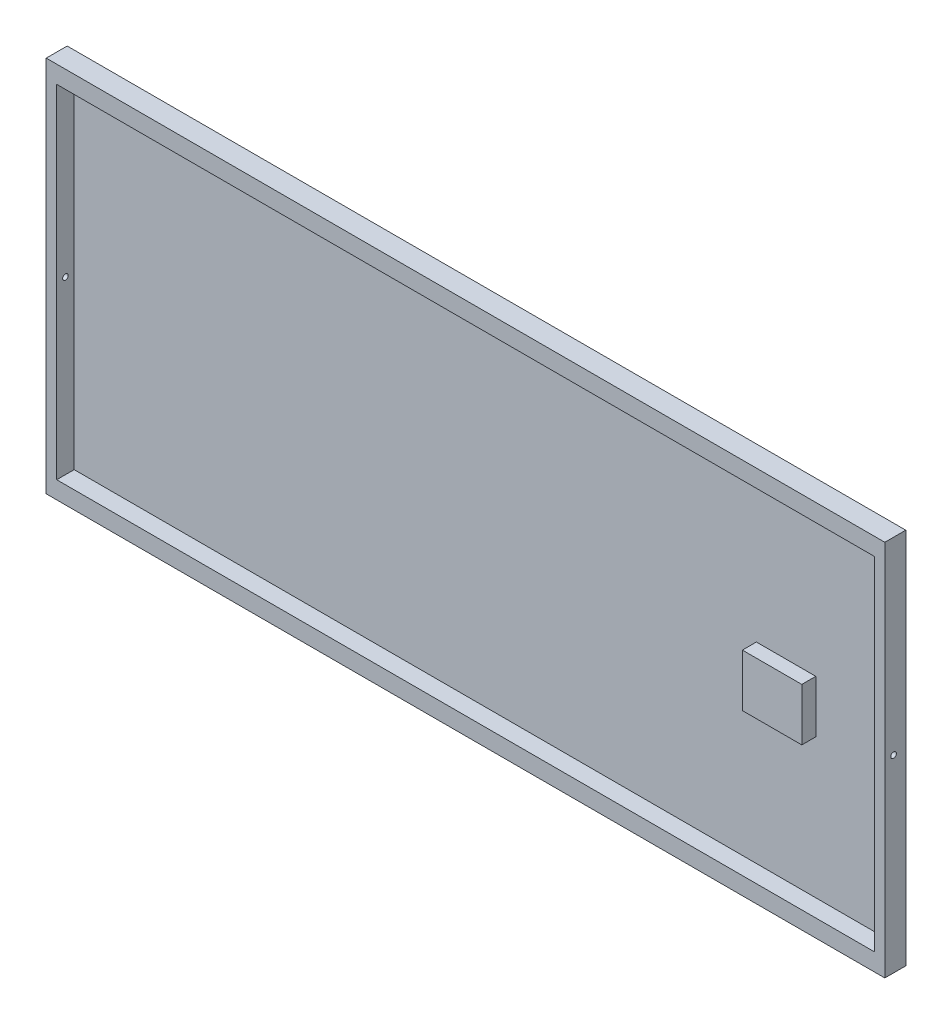
ISO-10303-21;
HEADER;
FILE_DESCRIPTION(('STEP AP214'),'2;1');
FILE_NAME('part.step','',(''),(''),'','','');
FILE_SCHEMA(('AUTOMOTIVE_DESIGN { 1 0 10303 214 1 1 1 1 }'));
ENDSEC;
DATA;
#1=APPLICATION_CONTEXT('core data for automotive mechanical design processes');
#2=APPLICATION_PROTOCOL_DEFINITION('international standard','automotive_design',2000,#1);
#3=PRODUCT_CONTEXT('',#1,'mechanical');
#4=PRODUCT('Part','Part','',(#3));
#5=PRODUCT_RELATED_PRODUCT_CATEGORY('part','',(#4));
#6=PRODUCT_DEFINITION_FORMATION('','',#4);
#7=PRODUCT_DEFINITION_CONTEXT('part definition',#1,'design');
#8=PRODUCT_DEFINITION('design','',#6,#7);
#9=PRODUCT_DEFINITION_SHAPE('','',#8);
#10=(LENGTH_UNIT() NAMED_UNIT(*) SI_UNIT(.MILLI.,.METRE.));
#11=(NAMED_UNIT(*) PLANE_ANGLE_UNIT() SI_UNIT($,.RADIAN.));
#12=(NAMED_UNIT(*) SI_UNIT($,.STERADIAN.) SOLID_ANGLE_UNIT());
#13=UNCERTAINTY_MEASURE_WITH_UNIT(LENGTH_MEASURE(1.E-05),#10,'distance_accuracy_value','');
#14=(GEOMETRIC_REPRESENTATION_CONTEXT(3) GLOBAL_UNCERTAINTY_ASSIGNED_CONTEXT((#13)) GLOBAL_UNIT_ASSIGNED_CONTEXT((#10,
#11,#12)) REPRESENTATION_CONTEXT('',''));
#15=CARTESIAN_POINT('',(0.,0.,0.));
#16=DIRECTION('',(0.,0.,1.));
#17=DIRECTION('',(1.,0.,0.));
#18=AXIS2_PLACEMENT_3D('',#15,#16,#17);
#19=CARTESIAN_POINT('',(930.672943193009,-215.300296093722,25.));
#20=DIRECTION('',(1.,0.,0.));
#21=DIRECTION('',(0.,1.,0.));
#22=AXIS2_PLACEMENT_3D('',#19,#20,#21);
#23=PLANE('',#22);
#24=CARTESIAN_POINT('',(930.672943193009,-230.168976304114,15.686983343187));
#25=DIRECTION('',(1.,0.,0.));
#26=DIRECTION('',(0.,1.,0.));
#27=AXIS2_PLACEMENT_3D('',#24,#25,#26);
#28=CIRCLE('',#27,2.5);
#29=CARTESIAN_POINT('',(930.672943193009,-227.668976304114,15.686983343187));
#30=VERTEX_POINT('',#29);
#31=EDGE_CURVE('E40',#30,#30,#28,.F.);
#32=ORIENTED_EDGE('',*,*,#31,.F.);
#33=EDGE_LOOP('',(#32));
#34=FACE_BOUND('',#33,.T.);
#35=DIRECTION('',(0.,-1.,0.));
#36=VECTOR('',#35,1.);
#37=CARTESIAN_POINT('',(930.672943193009,-215.300296093722,5.));
#38=LINE('',#37,#36);
#39=CARTESIAN_POINT('',(930.672943193009,-215.300296093722,5.));
#40=VERTEX_POINT('',#39);
#41=CARTESIAN_POINT('',(930.672943193009,-290.300296093722,5.));
#42=VERTEX_POINT('',#41);
#43=EDGE_CURVE('E144',#40,#42,#38,.T.);
#44=ORIENTED_EDGE('',*,*,#43,.T.);
#45=DIRECTION('',(0.,0.,-1.));
#46=VECTOR('',#45,1.);
#47=CARTESIAN_POINT('',(930.672943193009,-290.300296093722,25.));
#48=LINE('',#47,#46);
#49=CARTESIAN_POINT('',(930.672943193009,-290.300296093722,25.));
#50=VERTEX_POINT('',#49);
#51=EDGE_CURVE('E125',#50,#42,#48,.T.);
#52=ORIENTED_EDGE('',*,*,#51,.F.);
#53=DIRECTION('',(0.,-1.,0.));
#54=VECTOR('',#53,1.);
#55=CARTESIAN_POINT('',(930.672943193009,-215.300296093722,25.));
#56=LINE('',#55,#54);
#57=CARTESIAN_POINT('',(930.672943193009,-215.300296093722,25.));
#58=VERTEX_POINT('',#57);
#59=EDGE_CURVE('E132',#58,#50,#56,.T.);
#60=ORIENTED_EDGE('',*,*,#59,.F.);
#61=DIRECTION('',(0.,0.,-1.));
#62=VECTOR('',#61,1.);
#63=CARTESIAN_POINT('',(930.672943193009,-215.300296093722,25.));
#64=LINE('',#63,#62);
#65=EDGE_CURVE('E342',#58,#40,#64,.T.);
#66=ORIENTED_EDGE('',*,*,#65,.T.);
#67=EDGE_LOOP('',(#44,#52,#60,#66));
#68=FACE_BOUND('',#67,.T.);
#69=CARTESIAN_POINT('',(930.672943193009,-239.791974011941,15.686983343187));
#70=DIRECTION('',(1.,0.,0.));
#71=DIRECTION('',(0.,1.,0.));
#72=AXIS2_PLACEMENT_3D('',#69,#70,#71);
#73=CIRCLE('',#72,2.5);
#74=CARTESIAN_POINT('',(930.672943193009,-237.291974011941,15.686983343187));
#75=VERTEX_POINT('',#74);
#76=EDGE_CURVE('E11',#75,#75,#73,.F.);
#77=ORIENTED_EDGE('',*,*,#76,.F.);
#78=EDGE_LOOP('',(#77));
#79=FACE_BOUND('',#78,.T.);
#80=ADVANCED_FACE('F32',(#34,#68,#79),#23,.F.);
#81=CARTESIAN_POINT('',(-45.539504341441,-489.7752065244,5.));
#82=DIRECTION('',(0.,0.,1.));
#83=DIRECTION('',(1.,0.,0.));
#84=AXIS2_PLACEMENT_3D('',#81,#82,#83);
#85=PLANE('',#84);
#86=DIRECTION('',(0.,-1.,0.));
#87=VECTOR('',#86,1.);
#88=CARTESIAN_POINT('',(-45.539504341441,0.224793475600442,5.));
#89=LINE('',#88,#87);
#90=CARTESIAN_POINT('',(-45.539504341441,0.224793475600442,5.));
#91=VERTEX_POINT('',#90);
#92=CARTESIAN_POINT('',(-45.539504341441,-489.7752065244,5.));
#93=VERTEX_POINT('',#92);
#94=EDGE_CURVE('E160',#91,#93,#89,.T.);
#95=ORIENTED_EDGE('',*,*,#94,.T.);
#96=DIRECTION('',(1.,0.,0.));
#97=VECTOR('',#96,1.);
#98=CARTESIAN_POINT('',(-45.539504341441,-489.7752065244,5.));
#99=LINE('',#98,#97);
#100=CARTESIAN_POINT('',(1124.46049565856,-489.7752065244,5.));
#101=VERTEX_POINT('',#100);
#102=EDGE_CURVE('E163',#93,#101,#99,.T.);
#103=ORIENTED_EDGE('',*,*,#102,.T.);
#104=DIRECTION('',(0.,1.,0.));
#105=VECTOR('',#104,1.);
#106=CARTESIAN_POINT('',(1124.46049565856,0.224793475600442,5.));
#107=LINE('',#106,#105);
#108=CARTESIAN_POINT('',(1124.46049565856,0.224793475600442,5.));
#109=VERTEX_POINT('',#108);
#110=EDGE_CURVE('E167',#101,#109,#107,.T.);
#111=ORIENTED_EDGE('',*,*,#110,.T.);
#112=DIRECTION('',(-1.,0.,0.));
#113=VECTOR('',#112,1.);
#114=CARTESIAN_POINT('',(-45.539504341441,0.224793475600442,5.));
#115=LINE('',#114,#113);
#116=EDGE_CURVE('E170',#109,#91,#115,.T.);
#117=ORIENTED_EDGE('',*,*,#116,.T.);
#118=EDGE_LOOP('',(#95,#103,#111,#117));
#119=FACE_BOUND('',#118,.T.);
#120=DIRECTION('',(1.,0.,0.));
#121=VECTOR('',#120,1.);
#122=CARTESIAN_POINT('',(930.672943193009,-290.300296093722,5.));
#123=LINE('',#122,#121);
#124=CARTESIAN_POINT('',(1015.67294319301,-290.300296093722,5.));
#125=VERTEX_POINT('',#124);
#126=EDGE_CURVE('E344',#42,#125,#123,.T.);
#127=ORIENTED_EDGE('',*,*,#126,.F.);
#128=ORIENTED_EDGE('',*,*,#43,.F.);
#129=DIRECTION('',(-1.,0.,0.));
#130=VECTOR('',#129,1.);
#131=CARTESIAN_POINT('',(930.672943193009,-215.300296093722,5.));
#132=LINE('',#131,#130);
#133=CARTESIAN_POINT('',(1015.67294319301,-215.300296093722,5.));
#134=VERTEX_POINT('',#133);
#135=EDGE_CURVE('E140',#134,#40,#132,.T.);
#136=ORIENTED_EDGE('',*,*,#135,.F.);
#137=DIRECTION('',(0.,1.,0.));
#138=VECTOR('',#137,1.);
#139=CARTESIAN_POINT('',(1015.67294319301,-215.300296093722,5.));
#140=LINE('',#139,#138);
#141=EDGE_CURVE('E346',#125,#134,#140,.T.);
#142=ORIENTED_EDGE('',*,*,#141,.F.);
#143=EDGE_LOOP('',(#127,#128,#136,#142));
#144=FACE_BOUND('',#143,.T.);
#145=ADVANCED_FACE('F227',(#119,#144),#85,.T.);
#146=CARTESIAN_POINT('',(-60.539504341441,25.2247934756004,30.));
#147=DIRECTION('',(1.,0.,0.));
#148=DIRECTION('',(0.,1.,0.));
#149=AXIS2_PLACEMENT_3D('',#146,#147,#148);
#150=PLANE('',#149);
#151=CARTESIAN_POINT('',(-60.539504341441,-244.7752065244,17.5));
#152=DIRECTION('',(-1.,0.,0.));
#153=DIRECTION('',(0.,-1.,0.));
#154=AXIS2_PLACEMENT_3D('',#151,#152,#153);
#155=CIRCLE('',#154,4.);
#156=CARTESIAN_POINT('',(-60.539504341441,-248.7752065244,17.5));
#157=VERTEX_POINT('',#156);
#158=EDGE_CURVE('E146',#157,#157,#155,.T.);
#159=ORIENTED_EDGE('',*,*,#158,.F.);
#160=EDGE_LOOP('',(#159));
#161=FACE_BOUND('',#160,.T.);
#162=DIRECTION('',(0.,-1.,0.));
#163=VECTOR('',#162,1.);
#164=CARTESIAN_POINT('',(-60.539504341441,25.2247934756004,0.));
#165=LINE('',#164,#163);
#166=CARTESIAN_POINT('',(-60.539504341441,25.2247934756004,0.));
#167=VERTEX_POINT('',#166);
#168=CARTESIAN_POINT('',(-60.539504341441,-514.7752065244,0.));
#169=VERTEX_POINT('',#168);
#170=EDGE_CURVE('E185',#167,#169,#165,.T.);
#171=ORIENTED_EDGE('',*,*,#170,.T.);
#172=DIRECTION('',(0.,0.,-1.));
#173=VECTOR('',#172,1.);
#174=CARTESIAN_POINT('',(-60.539504341441,-514.7752065244,30.));
#175=LINE('',#174,#173);
#176=CARTESIAN_POINT('',(-60.539504341441,-514.7752065244,30.));
#177=VERTEX_POINT('',#176);
#178=EDGE_CURVE('E217',#177,#169,#175,.T.);
#179=ORIENTED_EDGE('',*,*,#178,.F.);
#180=DIRECTION('',(0.,-1.,0.));
#181=VECTOR('',#180,1.);
#182=CARTESIAN_POINT('',(-60.539504341441,25.2247934756004,30.));
#183=LINE('',#182,#181);
#184=CARTESIAN_POINT('',(-60.539504341441,25.2247934756004,30.));
#185=VERTEX_POINT('',#184);
#186=EDGE_CURVE('E191',#185,#177,#183,.T.);
#187=ORIENTED_EDGE('',*,*,#186,.F.);
#188=DIRECTION('',(0.,0.,-1.));
#189=VECTOR('',#188,1.);
#190=CARTESIAN_POINT('',(-60.539504341441,25.2247934756004,30.));
#191=LINE('',#190,#189);
#192=EDGE_CURVE('E201',#185,#167,#191,.T.);
#193=ORIENTED_EDGE('',*,*,#192,.T.);
#194=EDGE_LOOP('',(#171,#179,#187,#193));
#195=FACE_BOUND('',#194,.T.);
#196=ADVANCED_FACE('F34',(#161,#195),#150,.F.);
#197=CARTESIAN_POINT('',(-60.539504341441,-514.7752065244,30.));
#198=DIRECTION('',(0.,1.,0.));
#199=DIRECTION('',(0.,0.,1.));
#200=AXIS2_PLACEMENT_3D('',#197,#198,#199);
#201=PLANE('',#200);
#202=DIRECTION('',(1.,0.,0.));
#203=VECTOR('',#202,1.);
#204=CARTESIAN_POINT('',(-60.539504341441,-514.7752065244,0.));
#205=LINE('',#204,#203);
#206=CARTESIAN_POINT('',(1139.46049565856,-514.7752065244,0.));
#207=VERTEX_POINT('',#206);
#208=EDGE_CURVE('E204',#169,#207,#205,.T.);
#209=ORIENTED_EDGE('',*,*,#208,.T.);
#210=DIRECTION('',(0.,0.,-1.));
#211=VECTOR('',#210,1.);
#212=CARTESIAN_POINT('',(1139.46049565856,-514.7752065244,30.));
#213=LINE('',#212,#211);
#214=CARTESIAN_POINT('',(1139.46049565856,-514.7752065244,30.));
#215=VERTEX_POINT('',#214);
#216=EDGE_CURVE('E214',#215,#207,#213,.T.);
#217=ORIENTED_EDGE('',*,*,#216,.F.);
#218=DIRECTION('',(1.,0.,0.));
#219=VECTOR('',#218,1.);
#220=CARTESIAN_POINT('',(-60.539504341441,-514.7752065244,30.));
#221=LINE('',#220,#219);
#222=EDGE_CURVE('E194',#177,#215,#221,.T.);
#223=ORIENTED_EDGE('',*,*,#222,.F.);
#224=ORIENTED_EDGE('',*,*,#178,.T.);
#225=EDGE_LOOP('',(#209,#217,#223,#224));
#226=FACE_BOUND('',#225,.T.);
#227=ADVANCED_FACE('F272',(#226),#201,.F.);
#228=CARTESIAN_POINT('',(1139.46049565856,25.2247934756004,30.));
#229=DIRECTION('',(-1.,0.,0.));
#230=DIRECTION('',(0.,0.,1.));
#231=AXIS2_PLACEMENT_3D('',#228,#229,#230);
#232=PLANE('',#231);
#233=CARTESIAN_POINT('',(1139.46049565856,-244.775206524399,17.5));
#234=DIRECTION('',(-1.,0.,0.));
#235=DIRECTION('',(0.,0.,1.));
#236=AXIS2_PLACEMENT_3D('',#233,#234,#235);
#237=CIRCLE('',#236,4.);
#238=CARTESIAN_POINT('',(1139.46049565856,-244.775206524399,21.5));
#239=VERTEX_POINT('',#238);
#240=EDGE_CURVE('E157',#239,#239,#237,.T.);
#241=ORIENTED_EDGE('',*,*,#240,.T.);
#242=EDGE_LOOP('',(#241));
#243=FACE_BOUND('',#242,.T.);
#244=DIRECTION('',(0.,1.,0.));
#245=VECTOR('',#244,1.);
#246=CARTESIAN_POINT('',(1139.46049565856,25.2247934756004,0.));
#247=LINE('',#246,#245);
#248=CARTESIAN_POINT('',(1139.46049565856,25.2247934756004,0.));
#249=VERTEX_POINT('',#248);
#250=EDGE_CURVE('E206',#207,#249,#247,.T.);
#251=ORIENTED_EDGE('',*,*,#250,.T.);
#252=DIRECTION('',(0.,0.,-1.));
#253=VECTOR('',#252,1.);
#254=CARTESIAN_POINT('',(1139.46049565856,25.2247934756004,30.));
#255=LINE('',#254,#253);
#256=CARTESIAN_POINT('',(1139.46049565856,25.2247934756004,30.));
#257=VERTEX_POINT('',#256);
#258=EDGE_CURVE('E211',#257,#249,#255,.T.);
#259=ORIENTED_EDGE('',*,*,#258,.F.);
#260=DIRECTION('',(0.,1.,0.));
#261=VECTOR('',#260,1.);
#262=CARTESIAN_POINT('',(1139.46049565856,25.2247934756004,30.));
#263=LINE('',#262,#261);
#264=EDGE_CURVE('E197',#215,#257,#263,.T.);
#265=ORIENTED_EDGE('',*,*,#264,.F.);
#266=ORIENTED_EDGE('',*,*,#216,.T.);
#267=EDGE_LOOP('',(#251,#259,#265,#266));
#268=FACE_BOUND('',#267,.T.);
#269=ADVANCED_FACE('F269',(#243,#268),#232,.F.);
#270=CARTESIAN_POINT('',(-60.539504341441,25.2247934756004,30.));
#271=DIRECTION('',(0.,-1.,0.));
#272=DIRECTION('',(0.,0.,-1.));
#273=AXIS2_PLACEMENT_3D('',#270,#271,#272);
#274=PLANE('',#273);
#275=DIRECTION('',(-1.,0.,0.));
#276=VECTOR('',#275,1.);
#277=CARTESIAN_POINT('',(-60.539504341441,25.2247934756004,0.));
#278=LINE('',#277,#276);
#279=EDGE_CURVE('E195',#249,#167,#278,.T.);
#280=ORIENTED_EDGE('',*,*,#279,.T.);
#281=ORIENTED_EDGE('',*,*,#192,.F.);
#282=DIRECTION('',(-1.,0.,0.));
#283=VECTOR('',#282,1.);
#284=CARTESIAN_POINT('',(-60.539504341441,25.2247934756004,30.));
#285=LINE('',#284,#283);
#286=EDGE_CURVE('E199',#257,#185,#285,.T.);
#287=ORIENTED_EDGE('',*,*,#286,.F.);
#288=ORIENTED_EDGE('',*,*,#258,.T.);
#289=EDGE_LOOP('',(#280,#281,#287,#288));
#290=FACE_BOUND('',#289,.T.);
#291=ADVANCED_FACE('F262',(#290),#274,.F.);
#292=CARTESIAN_POINT('',(-60.539504341441,-514.7752065244,30.));
#293=DIRECTION('',(0.,0.,1.));
#294=DIRECTION('',(1.,0.,0.));
#295=AXIS2_PLACEMENT_3D('',#292,#293,#294);
#296=PLANE('',#295);
#297=DIRECTION('',(0.,-1.,0.));
#298=VECTOR('',#297,1.);
#299=CARTESIAN_POINT('',(-45.539504341441,0.224793475600442,30.));
#300=LINE('',#299,#298);
#301=CARTESIAN_POINT('',(-45.539504341441,0.224793475600442,30.));
#302=VERTEX_POINT('',#301);
#303=CARTESIAN_POINT('',(-45.539504341441,-489.7752065244,30.));
#304=VERTEX_POINT('',#303);
#305=EDGE_CURVE('E55',#302,#304,#300,.T.);
#306=ORIENTED_EDGE('',*,*,#305,.F.);
#307=DIRECTION('',(-1.,0.,0.));
#308=VECTOR('',#307,1.);
#309=CARTESIAN_POINT('',(-45.539504341441,0.224793475600442,30.));
#310=LINE('',#309,#308);
#311=CARTESIAN_POINT('',(1124.46049565856,0.224793475600442,30.));
#312=VERTEX_POINT('',#311);
#313=EDGE_CURVE('E164',#312,#302,#310,.T.);
#314=ORIENTED_EDGE('',*,*,#313,.F.);
#315=DIRECTION('',(0.,1.,0.));
#316=VECTOR('',#315,1.);
#317=CARTESIAN_POINT('',(1124.46049565856,0.224793475600442,30.));
#318=LINE('',#317,#316);
#319=CARTESIAN_POINT('',(1124.46049565856,-489.7752065244,30.));
#320=VERTEX_POINT('',#319);
#321=EDGE_CURVE('E178',#320,#312,#318,.T.);
#322=ORIENTED_EDGE('',*,*,#321,.F.);
#323=DIRECTION('',(1.,0.,0.));
#324=VECTOR('',#323,1.);
#325=CARTESIAN_POINT('',(-45.539504341441,-489.7752065244,30.));
#326=LINE('',#325,#324);
#327=EDGE_CURVE('E175',#304,#320,#326,.T.);
#328=ORIENTED_EDGE('',*,*,#327,.F.);
#329=EDGE_LOOP('',(#306,#314,#322,#328));
#330=FACE_BOUND('',#329,.T.);
#331=ORIENTED_EDGE('',*,*,#186,.T.);
#332=ORIENTED_EDGE('',*,*,#222,.T.);
#333=ORIENTED_EDGE('',*,*,#264,.T.);
#334=ORIENTED_EDGE('',*,*,#286,.T.);
#335=EDGE_LOOP('',(#331,#332,#333,#334));
#336=FACE_BOUND('',#335,.T.);
#337=ADVANCED_FACE('F259',(#330,#336),#296,.T.);
#338=CARTESIAN_POINT('',(-60.539504341441,-514.7752065244,0.));
#339=DIRECTION('',(0.,0.,1.));
#340=DIRECTION('',(1.,0.,0.));
#341=AXIS2_PLACEMENT_3D('',#338,#339,#340);
#342=PLANE('',#341);
#343=ORIENTED_EDGE('',*,*,#170,.F.);
#344=ORIENTED_EDGE('',*,*,#279,.F.);
#345=ORIENTED_EDGE('',*,*,#250,.F.);
#346=ORIENTED_EDGE('',*,*,#208,.F.);
#347=EDGE_LOOP('',(#343,#344,#345,#346));
#348=FACE_BOUND('',#347,.T.);
#349=ADVANCED_FACE('F257',(#348),#342,.F.);
#350=CARTESIAN_POINT('',(-45.539504341441,0.224793475600442,5.));
#351=DIRECTION('',(-1.,0.,0.));
#352=DIRECTION('',(0.,-1.,0.));
#353=AXIS2_PLACEMENT_3D('',#350,#351,#352);
#354=PLANE('',#353);
#355=CARTESIAN_POINT('',(-45.5395043414413,-244.7752065244,17.5));
#356=DIRECTION('',(-1.,0.,0.));
#357=DIRECTION('',(0.,-1.,0.));
#358=AXIS2_PLACEMENT_3D('',#355,#356,#357);
#359=CIRCLE('',#358,4.);
#360=CARTESIAN_POINT('',(-45.5395043414413,-248.7752065244,17.5));
#361=VERTEX_POINT('',#360);
#362=EDGE_CURVE('E154',#361,#361,#359,.T.);
#363=ORIENTED_EDGE('',*,*,#362,.T.);
#364=EDGE_LOOP('',(#363));
#365=FACE_BOUND('',#364,.T.);
#366=ORIENTED_EDGE('',*,*,#305,.T.);
#367=DIRECTION('',(0.,0.,1.));
#368=VECTOR('',#367,1.);
#369=CARTESIAN_POINT('',(-45.539504341441,-489.7752065244,5.));
#370=LINE('',#369,#368);
#371=EDGE_CURVE('E173',#93,#304,#370,.T.);
#372=ORIENTED_EDGE('',*,*,#371,.F.);
#373=ORIENTED_EDGE('',*,*,#94,.F.);
#374=DIRECTION('',(0.,0.,1.));
#375=VECTOR('',#374,1.);
#376=CARTESIAN_POINT('',(-45.539504341441,0.224793475600442,5.));
#377=LINE('',#376,#375);
#378=EDGE_CURVE('E183',#91,#302,#377,.T.);
#379=ORIENTED_EDGE('',*,*,#378,.T.);
#380=EDGE_LOOP('',(#366,#372,#373,#379));
#381=FACE_BOUND('',#380,.T.);
#382=ADVANCED_FACE('F247',(#365,#381),#354,.F.);
#383=CARTESIAN_POINT('',(-45.539504341441,0.224793475600442,5.));
#384=DIRECTION('',(0.,1.,0.));
#385=DIRECTION('',(0.,0.,1.));
#386=AXIS2_PLACEMENT_3D('',#383,#384,#385);
#387=PLANE('',#386);
#388=ORIENTED_EDGE('',*,*,#313,.T.);
#389=ORIENTED_EDGE('',*,*,#378,.F.);
#390=ORIENTED_EDGE('',*,*,#116,.F.);
#391=DIRECTION('',(0.,0.,1.));
#392=VECTOR('',#391,1.);
#393=CARTESIAN_POINT('',(1124.46049565856,0.224793475600442,5.));
#394=LINE('',#393,#392);
#395=EDGE_CURVE('E186',#109,#312,#394,.T.);
#396=ORIENTED_EDGE('',*,*,#395,.T.);
#397=EDGE_LOOP('',(#388,#389,#390,#396));
#398=FACE_BOUND('',#397,.T.);
#399=ADVANCED_FACE('F243',(#398),#387,.F.);
#400=CARTESIAN_POINT('',(1124.46049565856,0.224793475600442,5.));
#401=DIRECTION('',(1.,0.,0.));
#402=DIRECTION('',(0.,0.,-1.));
#403=AXIS2_PLACEMENT_3D('',#400,#401,#402);
#404=PLANE('',#403);
#405=CARTESIAN_POINT('',(1124.46049565856,-244.775206524399,17.5));
#406=DIRECTION('',(1.,0.,0.));
#407=DIRECTION('',(0.,0.,-1.));
#408=AXIS2_PLACEMENT_3D('',#405,#406,#407);
#409=CIRCLE('',#408,4.);
#410=CARTESIAN_POINT('',(1124.46049565856,-244.775206524399,13.5));
#411=VERTEX_POINT('',#410);
#412=EDGE_CURVE('E149',#411,#411,#409,.T.);
#413=ORIENTED_EDGE('',*,*,#412,.T.);
#414=EDGE_LOOP('',(#413));
#415=FACE_BOUND('',#414,.T.);
#416=ORIENTED_EDGE('',*,*,#321,.T.);
#417=ORIENTED_EDGE('',*,*,#395,.F.);
#418=ORIENTED_EDGE('',*,*,#110,.F.);
#419=DIRECTION('',(0.,0.,1.));
#420=VECTOR('',#419,1.);
#421=CARTESIAN_POINT('',(1124.46049565856,-489.7752065244,5.));
#422=LINE('',#421,#420);
#423=EDGE_CURVE('E188',#101,#320,#422,.T.);
#424=ORIENTED_EDGE('',*,*,#423,.T.);
#425=EDGE_LOOP('',(#416,#417,#418,#424));
#426=FACE_BOUND('',#425,.T.);
#427=ADVANCED_FACE('F246',(#415,#426),#404,.F.);
#428=CARTESIAN_POINT('',(-45.539504341441,-489.7752065244,5.));
#429=DIRECTION('',(0.,-1.,0.));
#430=DIRECTION('',(0.,0.,-1.));
#431=AXIS2_PLACEMENT_3D('',#428,#429,#430);
#432=PLANE('',#431);
#433=ORIENTED_EDGE('',*,*,#327,.T.);
#434=ORIENTED_EDGE('',*,*,#423,.F.);
#435=ORIENTED_EDGE('',*,*,#102,.F.);
#436=ORIENTED_EDGE('',*,*,#371,.T.);
#437=EDGE_LOOP('',(#433,#434,#435,#436));
#438=FACE_BOUND('',#437,.T.);
#439=ADVANCED_FACE('F240',(#438),#432,.F.);
#440=CARTESIAN_POINT('',(11939.4604956586,-244.775206524398,17.5));
#441=DIRECTION('',(-1.,0.,0.));
#442=DIRECTION('',(0.,-1.,0.));
#443=AXIS2_PLACEMENT_3D('',#440,#441,#442);
#444=CYLINDRICAL_SURFACE('',#443,4.);
#445=ORIENTED_EDGE('',*,*,#412,.F.);
#446=EDGE_LOOP('',(#445));
#447=FACE_BOUND('',#446,.T.);
#448=ORIENTED_EDGE('',*,*,#240,.F.);
#449=EDGE_LOOP('',(#448));
#450=FACE_BOUND('',#449,.T.);
#451=ADVANCED_FACE('F237',(#447,#450),#444,.F.);
#452=ORIENTED_EDGE('',*,*,#158,.T.);
#453=EDGE_LOOP('',(#452));
#454=FACE_BOUND('',#453,.T.);
#455=ORIENTED_EDGE('',*,*,#362,.F.);
#456=EDGE_LOOP('',(#455));
#457=FACE_BOUND('',#456,.T.);
#458=ADVANCED_FACE('F239',(#454,#457),#444,.F.);
#459=CARTESIAN_POINT('',(930.672943193009,-290.300296093722,25.));
#460=DIRECTION('',(0.,1.,0.));
#461=DIRECTION('',(0.,0.,1.));
#462=AXIS2_PLACEMENT_3D('',#459,#460,#461);
#463=PLANE('',#462);
#464=ORIENTED_EDGE('',*,*,#126,.T.);
#465=DIRECTION('',(0.,0.,-1.));
#466=VECTOR('',#465,1.);
#467=CARTESIAN_POINT('',(1015.67294319301,-290.300296093722,25.));
#468=LINE('',#467,#466);
#469=CARTESIAN_POINT('',(1015.67294319301,-290.300296093722,25.));
#470=VERTEX_POINT('',#469);
#471=EDGE_CURVE('E128',#470,#125,#468,.T.);
#472=ORIENTED_EDGE('',*,*,#471,.F.);
#473=DIRECTION('',(1.,0.,0.));
#474=VECTOR('',#473,1.);
#475=CARTESIAN_POINT('',(930.672943193009,-290.300296093722,25.));
#476=LINE('',#475,#474);
#477=EDGE_CURVE('E121',#50,#470,#476,.T.);
#478=ORIENTED_EDGE('',*,*,#477,.F.);
#479=ORIENTED_EDGE('',*,*,#51,.T.);
#480=EDGE_LOOP('',(#464,#472,#478,#479));
#481=FACE_BOUND('',#480,.T.);
#482=ADVANCED_FACE('F123',(#481),#463,.F.);
#483=CARTESIAN_POINT('',(1015.67294319301,-215.300296093722,25.));
#484=DIRECTION('',(-1.,0.,0.));
#485=DIRECTION('',(0.,0.,1.));
#486=AXIS2_PLACEMENT_3D('',#483,#484,#485);
#487=PLANE('',#486);
#488=ORIENTED_EDGE('',*,*,#141,.T.);
#489=DIRECTION('',(0.,0.,-1.));
#490=VECTOR('',#489,1.);
#491=CARTESIAN_POINT('',(1015.67294319301,-215.300296093722,25.));
#492=LINE('',#491,#490);
#493=CARTESIAN_POINT('',(1015.67294319301,-215.300296093722,25.));
#494=VERTEX_POINT('',#493);
#495=EDGE_CURVE('E47',#494,#134,#492,.T.);
#496=ORIENTED_EDGE('',*,*,#495,.F.);
#497=DIRECTION('',(0.,1.,0.));
#498=VECTOR('',#497,1.);
#499=CARTESIAN_POINT('',(1015.67294319301,-215.300296093722,25.));
#500=LINE('',#499,#498);
#501=EDGE_CURVE('E131',#470,#494,#500,.T.);
#502=ORIENTED_EDGE('',*,*,#501,.F.);
#503=ORIENTED_EDGE('',*,*,#471,.T.);
#504=EDGE_LOOP('',(#488,#496,#502,#503));
#505=FACE_BOUND('',#504,.T.);
#506=ADVANCED_FACE('F303',(#505),#487,.F.);
#507=CARTESIAN_POINT('',(930.672943193009,-215.300296093722,25.));
#508=DIRECTION('',(0.,-1.,0.));
#509=DIRECTION('',(0.,0.,-1.));
#510=AXIS2_PLACEMENT_3D('',#507,#508,#509);
#511=PLANE('',#510);
#512=ORIENTED_EDGE('',*,*,#135,.T.);
#513=ORIENTED_EDGE('',*,*,#65,.F.);
#514=DIRECTION('',(-1.,0.,0.));
#515=VECTOR('',#514,1.);
#516=CARTESIAN_POINT('',(930.672943193009,-215.300296093722,25.));
#517=LINE('',#516,#515);
#518=EDGE_CURVE('E136',#494,#58,#517,.T.);
#519=ORIENTED_EDGE('',*,*,#518,.F.);
#520=ORIENTED_EDGE('',*,*,#495,.T.);
#521=EDGE_LOOP('',(#512,#513,#519,#520));
#522=FACE_BOUND('',#521,.T.);
#523=ADVANCED_FACE('F307',(#522),#511,.F.);
#524=CARTESIAN_POINT('',(930.672943193009,-290.300296093722,25.));
#525=DIRECTION('',(0.,0.,1.));
#526=DIRECTION('',(1.,0.,0.));
#527=AXIS2_PLACEMENT_3D('',#524,#525,#526);
#528=PLANE('',#527);
#529=ORIENTED_EDGE('',*,*,#59,.T.);
#530=ORIENTED_EDGE('',*,*,#477,.T.);
#531=ORIENTED_EDGE('',*,*,#501,.T.);
#532=ORIENTED_EDGE('',*,*,#518,.T.);
#533=EDGE_LOOP('',(#529,#530,#531,#532));
#534=FACE_BOUND('',#533,.T.);
#535=ADVANCED_FACE('F135',(#534),#528,.T.);
#536=CARTESIAN_POINT('',(925.672943193009,-230.168976304114,15.686983343187));
#537=DIRECTION('',(1.,0.,0.));
#538=DIRECTION('',(0.,1.,0.));
#539=AXIS2_PLACEMENT_3D('',#536,#537,#538);
#540=CYLINDRICAL_SURFACE('',#539,2.5);
#541=CARTESIAN_POINT('',(925.672943193009,-230.168976304114,15.686983343187));
#542=DIRECTION('',(-1.,0.,0.));
#543=DIRECTION('',(0.,-1.,0.));
#544=AXIS2_PLACEMENT_3D('',#541,#542,#543);
#545=CIRCLE('',#544,2.5);
#546=CARTESIAN_POINT('',(925.672943193009,-232.668976304114,15.686983343187));
#547=VERTEX_POINT('',#546);
#548=EDGE_CURVE('E335',#547,#547,#545,.T.);
#549=ORIENTED_EDGE('',*,*,#548,.F.);
#550=EDGE_LOOP('',(#549));
#551=FACE_BOUND('',#550,.T.);
#552=ORIENTED_EDGE('',*,*,#31,.T.);
#553=EDGE_LOOP('',(#552));
#554=FACE_BOUND('',#553,.T.);
#555=ADVANCED_FACE('F224',(#551,#554),#540,.T.);
#556=CARTESIAN_POINT('',(925.672943193009,-230.168976304114,15.686983343187));
#557=DIRECTION('',(-1.,0.,0.));
#558=DIRECTION('',(0.,-1.,0.));
#559=AXIS2_PLACEMENT_3D('',#556,#557,#558);
#560=PLANE('',#559);
#561=ORIENTED_EDGE('',*,*,#548,.T.);
#562=EDGE_LOOP('',(#561));
#563=FACE_BOUND('',#562,.T.);
#564=ADVANCED_FACE('F318',(#563),#560,.T.);
#565=CARTESIAN_POINT('',(925.672943193009,-239.791974011941,15.686983343187));
#566=DIRECTION('',(1.,0.,0.));
#567=DIRECTION('',(0.,1.,0.));
#568=AXIS2_PLACEMENT_3D('',#565,#566,#567);
#569=CYLINDRICAL_SURFACE('',#568,2.5);
#570=CARTESIAN_POINT('',(925.672943193009,-239.791974011941,15.686983343187));
#571=DIRECTION('',(-1.,0.,0.));
#572=DIRECTION('',(0.,-1.,0.));
#573=AXIS2_PLACEMENT_3D('',#570,#571,#572);
#574=CIRCLE('',#573,2.5);
#575=CARTESIAN_POINT('',(925.672943193009,-242.291974011941,15.686983343187));
#576=VERTEX_POINT('',#575);
#577=EDGE_CURVE('E334',#576,#576,#574,.T.);
#578=ORIENTED_EDGE('',*,*,#577,.F.);
#579=EDGE_LOOP('',(#578));
#580=FACE_BOUND('',#579,.T.);
#581=ORIENTED_EDGE('',*,*,#76,.T.);
#582=EDGE_LOOP('',(#581));
#583=FACE_BOUND('',#582,.T.);
#584=ADVANCED_FACE('F322',(#580,#583),#569,.T.);
#585=CARTESIAN_POINT('',(925.672943193009,-239.791974011941,15.686983343187));
#586=DIRECTION('',(-1.,0.,0.));
#587=DIRECTION('',(0.,-1.,0.));
#588=AXIS2_PLACEMENT_3D('',#585,#586,#587);
#589=PLANE('',#588);
#590=ORIENTED_EDGE('',*,*,#577,.T.);
#591=EDGE_LOOP('',(#590));
#592=FACE_BOUND('',#591,.T.);
#593=ADVANCED_FACE('F326',(#592),#589,.T.);
#594=CLOSED_SHELL('',(#80,#145,#196,#227,#269,#291,#337,#349,#382,#399,#427,#439,#451,#458,#482,
#506,#523,#535,#555,#564,#584,#593));
#595=MANIFOLD_SOLID_BREP('B2',#594);
#596=ADVANCED_BREP_SHAPE_REPRESENTATION('',(#18,#595),#14);
#597=SHAPE_DEFINITION_REPRESENTATION(#9,#596);
ENDSEC;
END-ISO-10303-21;
